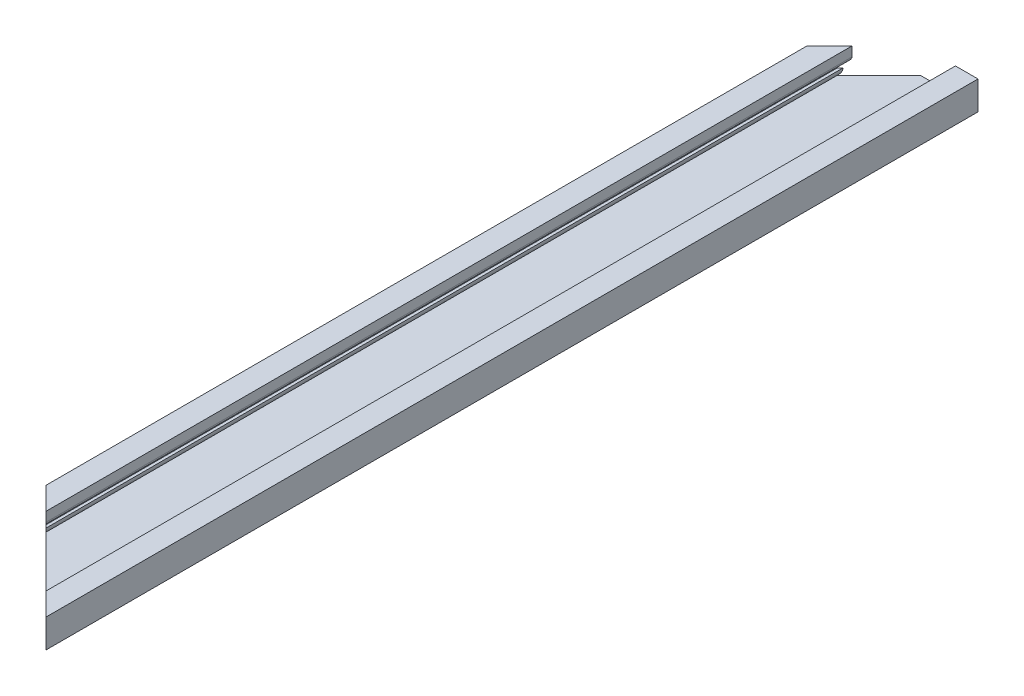
ISO-10303-21;
HEADER;
FILE_DESCRIPTION(('STEP AP214'),'2;1');
FILE_NAME('part.step','',(''),(''),'','','');
FILE_SCHEMA(('AUTOMOTIVE_DESIGN { 1 0 10303 214 1 1 1 1 }'));
ENDSEC;
DATA;
#1=APPLICATION_CONTEXT('core data for automotive mechanical design processes');
#2=APPLICATION_PROTOCOL_DEFINITION('international standard','automotive_design',2000,#1);
#3=PRODUCT_CONTEXT('',#1,'mechanical');
#4=PRODUCT('Part','Part','',(#3));
#5=PRODUCT_RELATED_PRODUCT_CATEGORY('part','',(#4));
#6=PRODUCT_DEFINITION_FORMATION('','',#4);
#7=PRODUCT_DEFINITION_CONTEXT('part definition',#1,'design');
#8=PRODUCT_DEFINITION('design','',#6,#7);
#9=PRODUCT_DEFINITION_SHAPE('','',#8);
#10=(LENGTH_UNIT() NAMED_UNIT(*) SI_UNIT(.MILLI.,.METRE.));
#11=(NAMED_UNIT(*) PLANE_ANGLE_UNIT() SI_UNIT($,.RADIAN.));
#12=(NAMED_UNIT(*) SI_UNIT($,.STERADIAN.) SOLID_ANGLE_UNIT());
#13=UNCERTAINTY_MEASURE_WITH_UNIT(LENGTH_MEASURE(1.E-05),#10,'distance_accuracy_value','');
#14=(GEOMETRIC_REPRESENTATION_CONTEXT(3) GLOBAL_UNCERTAINTY_ASSIGNED_CONTEXT((#13)) GLOBAL_UNIT_ASSIGNED_CONTEXT((#10,
#11,#12)) REPRESENTATION_CONTEXT('',''));
#15=CARTESIAN_POINT('',(0.,0.,0.));
#16=DIRECTION('',(0.,0.,1.));
#17=DIRECTION('',(1.,0.,0.));
#18=AXIS2_PLACEMENT_3D('',#15,#16,#17);
#19=CARTESIAN_POINT('',(-30.,7.5,520.));
#20=DIRECTION('',(0.,-1.,0.));
#21=DIRECTION('',(0.,0.,-1.));
#22=AXIS2_PLACEMENT_3D('',#19,#20,#21);
#23=PLANE('',#22);
#24=DIRECTION('',(0.707106781186546,0.,-0.707106781186549));
#25=VECTOR('',#24,1.);
#26=CARTESIAN_POINT('',(15.0000000000001,7.5,15.));
#27=LINE('',#26,#25);
#28=CARTESIAN_POINT('',(-30.,7.5,60.0000000000002));
#29=VERTEX_POINT('',#28);
#30=CARTESIAN_POINT('',(-18.1568883594902,7.5,48.1568883594904));
#31=VERTEX_POINT('',#30);
#32=EDGE_CURVE('E276',#29,#31,#27,.T.);
#33=ORIENTED_EDGE('',*,*,#32,.F.);
#34=DIRECTION('',(0.,0.,-1.));
#35=VECTOR('',#34,1.);
#36=CARTESIAN_POINT('',(-30.,7.5,520.));
#37=LINE('',#36,#35);
#38=CARTESIAN_POINT('',(-30.,7.5,460.));
#39=VERTEX_POINT('',#38);
#40=EDGE_CURVE('E201',#39,#29,#37,.T.);
#41=ORIENTED_EDGE('',*,*,#40,.F.);
#42=DIRECTION('',(0.707106781186546,0.,0.707106781186549));
#43=VECTOR('',#42,1.);
#44=CARTESIAN_POINT('',(-245.,7.5,244.999999999999));
#45=LINE('',#44,#43);
#46=CARTESIAN_POINT('',(-18.1568883594903,7.5,471.84311164051));
#47=VERTEX_POINT('',#46);
#48=EDGE_CURVE('E288',#39,#47,#45,.T.);
#49=ORIENTED_EDGE('',*,*,#48,.T.);
#50=DIRECTION('',(0.,0.,-1.));
#51=VECTOR('',#50,1.);
#52=CARTESIAN_POINT('',(-18.1568883594903,7.5,520.));
#53=LINE('',#52,#51);
#54=EDGE_CURVE('E358',#47,#31,#53,.T.);
#55=ORIENTED_EDGE('',*,*,#54,.T.);
#56=EDGE_LOOP('',(#33,#41,#49,#55));
#57=FACE_BOUND('',#56,.T.);
#58=ADVANCED_FACE('F43',(#57),#23,.F.);
#59=CARTESIAN_POINT('',(25.,0.5,520.));
#60=DIRECTION('',(0.,1.,0.));
#61=DIRECTION('',(-1.,0.,0.));
#62=AXIS2_PLACEMENT_3D('',#59,#60,#61);
#63=PLANE('',#62);
#64=DIRECTION('',(-0.707106781186546,0.,0.707106781186549));
#65=VECTOR('',#64,1.);
#66=CARTESIAN_POINT('',(-232.5,0.499999999999999,262.500000000001));
#67=LINE('',#66,#65);
#68=CARTESIAN_POINT('',(-20.1568883594903,0.5,50.1568883594904));
#69=VERTEX_POINT('',#68);
#70=CARTESIAN_POINT('',(-25.,0.5,55.0000000000002));
#71=VERTEX_POINT('',#70);
#72=EDGE_CURVE('E348',#69,#71,#67,.T.);
#73=ORIENTED_EDGE('',*,*,#72,.F.);
#74=DIRECTION('',(0.,0.,-1.));
#75=VECTOR('',#74,1.);
#76=CARTESIAN_POINT('',(-20.1568883594903,0.5,520.));
#77=LINE('',#76,#75);
#78=CARTESIAN_POINT('',(-20.1568883594903,0.5,469.84311164051));
#79=VERTEX_POINT('',#78);
#80=EDGE_CURVE('E219',#69,#79,#77,.F.);
#81=ORIENTED_EDGE('',*,*,#80,.T.);
#82=DIRECTION('',(-0.707106781186546,0.,-0.707106781186549));
#83=VECTOR('',#82,1.);
#84=CARTESIAN_POINT('',(27.5,0.5,517.5));
#85=LINE('',#84,#83);
#86=CARTESIAN_POINT('',(-25.,0.5,465.));
#87=VERTEX_POINT('',#86);
#88=EDGE_CURVE('E324',#79,#87,#85,.T.);
#89=ORIENTED_EDGE('',*,*,#88,.T.);
#90=DIRECTION('',(0.,0.,-1.));
#91=VECTOR('',#90,1.);
#92=CARTESIAN_POINT('',(-25.,0.5,520.));
#93=LINE('',#92,#91);
#94=EDGE_CURVE('E373',#87,#71,#93,.T.);
#95=ORIENTED_EDGE('',*,*,#94,.T.);
#96=EDGE_LOOP('',(#73,#81,#89,#95));
#97=FACE_BOUND('',#96,.T.);
#98=ADVANCED_FACE('F416',(#97),#63,.F.);
#99=DIRECTION('',(0.,0.,-1.));
#100=VECTOR('',#99,1.);
#101=CARTESIAN_POINT('',(30.,7.5,520.));
#102=LINE('',#101,#100);
#103=CARTESIAN_POINT('',(30.,7.5,520.));
#104=VERTEX_POINT('',#103);
#105=CARTESIAN_POINT('',(30.,7.5,30.0000000000001));
#106=VERTEX_POINT('',#105);
#107=EDGE_CURVE('E190',#104,#106,#102,.T.);
#108=ORIENTED_EDGE('',*,*,#107,.T.);
#109=DIRECTION('',(-1.,0.,0.));
#110=VECTOR('',#109,1.);
#111=CARTESIAN_POINT('',(30.,7.5,30.0000000000001));
#112=LINE('',#111,#110);
#113=CARTESIAN_POINT('',(18.1431116405097,7.5,30.0000000000001));
#114=VERTEX_POINT('',#113);
#115=EDGE_CURVE('E174',#106,#114,#112,.T.);
#116=ORIENTED_EDGE('',*,*,#115,.T.);
#117=DIRECTION('',(0.,0.,-1.));
#118=VECTOR('',#117,1.);
#119=CARTESIAN_POINT('',(18.1431116405097,7.5,520.));
#120=LINE('',#119,#118);
#121=CARTESIAN_POINT('',(18.1431116405097,7.5,508.14311164051));
#122=VERTEX_POINT('',#121);
#123=EDGE_CURVE('E359',#122,#114,#120,.T.);
#124=ORIENTED_EDGE('',*,*,#123,.F.);
#125=EDGE_CURVE('E198',#122,#104,#45,.T.);
#126=ORIENTED_EDGE('',*,*,#125,.T.);
#127=EDGE_LOOP('',(#108,#116,#124,#126));
#128=FACE_BOUND('',#127,.T.);
#129=ADVANCED_FACE('F197',(#128),#23,.F.);
#130=CARTESIAN_POINT('',(-30.,7.5,520.));
#131=DIRECTION('',(1.,0.,0.));
#132=DIRECTION('',(0.,1.,0.));
#133=AXIS2_PLACEMENT_3D('',#130,#131,#132);
#134=PLANE('',#133);
#135=DIRECTION('',(0.,-1.,0.));
#136=VECTOR('',#135,1.);
#137=CARTESIAN_POINT('',(-30.,7.5,60.0000000000002));
#138=LINE('',#137,#136);
#139=CARTESIAN_POINT('',(-30.,-7.5,60.0000000000002));
#140=VERTEX_POINT('',#139);
#141=EDGE_CURVE('E279',#29,#140,#138,.T.);
#142=ORIENTED_EDGE('',*,*,#141,.T.);
#143=DIRECTION('',(0.,0.,-1.));
#144=VECTOR('',#143,1.);
#145=CARTESIAN_POINT('',(-30.,-7.5,520.));
#146=LINE('',#145,#144);
#147=CARTESIAN_POINT('',(-30.,-7.5,460.));
#148=VERTEX_POINT('',#147);
#149=EDGE_CURVE('E208',#148,#140,#146,.T.);
#150=ORIENTED_EDGE('',*,*,#149,.F.);
#151=DIRECTION('',(0.,-1.,0.));
#152=VECTOR('',#151,1.);
#153=CARTESIAN_POINT('',(-30.,7.5,460.));
#154=LINE('',#153,#152);
#155=EDGE_CURVE('E284',#39,#148,#154,.T.);
#156=ORIENTED_EDGE('',*,*,#155,.F.);
#157=ORIENTED_EDGE('',*,*,#40,.T.);
#158=EDGE_LOOP('',(#142,#150,#156,#157));
#159=FACE_BOUND('',#158,.T.);
#160=ADVANCED_FACE('F399',(#159),#134,.F.);
#161=CARTESIAN_POINT('',(-30.,-7.5,520.));
#162=DIRECTION('',(0.,1.,0.));
#163=DIRECTION('',(0.,0.,1.));
#164=AXIS2_PLACEMENT_3D('',#161,#162,#163);
#165=PLANE('',#164);
#166=DIRECTION('',(0.707106781186546,0.,-0.707106781186549));
#167=VECTOR('',#166,1.);
#168=CARTESIAN_POINT('',(15.0000000000001,-7.5,15.));
#169=LINE('',#168,#167);
#170=CARTESIAN_POINT('',(0.,-7.5,30.0000000000001));
#171=VERTEX_POINT('',#170);
#172=EDGE_CURVE('E280',#140,#171,#169,.T.);
#173=ORIENTED_EDGE('',*,*,#172,.T.);
#174=DIRECTION('',(1.,0.,0.));
#175=VECTOR('',#174,1.);
#176=CARTESIAN_POINT('',(-29.9999999999999,-7.5,30.0000000000001));
#177=LINE('',#176,#175);
#178=CARTESIAN_POINT('',(30.,-7.5,30.0000000000001));
#179=VERTEX_POINT('',#178);
#180=EDGE_CURVE('E58',#171,#179,#177,.T.);
#181=ORIENTED_EDGE('',*,*,#180,.T.);
#182=DIRECTION('',(0.,0.,-1.));
#183=VECTOR('',#182,1.);
#184=CARTESIAN_POINT('',(30.,-7.5,520.));
#185=LINE('',#184,#183);
#186=CARTESIAN_POINT('',(30.,-7.5,520.));
#187=VERTEX_POINT('',#186);
#188=EDGE_CURVE('E192',#187,#179,#185,.T.);
#189=ORIENTED_EDGE('',*,*,#188,.F.);
#190=DIRECTION('',(0.707106781186546,0.,0.707106781186549));
#191=VECTOR('',#190,1.);
#192=CARTESIAN_POINT('',(-245.,-7.5,244.999999999999));
#193=LINE('',#192,#191);
#194=EDGE_CURVE('E275',#148,#187,#193,.T.);
#195=ORIENTED_EDGE('',*,*,#194,.F.);
#196=ORIENTED_EDGE('',*,*,#149,.T.);
#197=EDGE_LOOP('',(#173,#181,#189,#195,#196));
#198=FACE_BOUND('',#197,.T.);
#199=ADVANCED_FACE('F396',(#198),#165,.F.);
#200=CARTESIAN_POINT('',(-25.,-2.5,520.));
#201=DIRECTION('',(0.,0.,-1.));
#202=DIRECTION('',(-1.,0.,0.));
#203=AXIS2_PLACEMENT_3D('',#200,#201,#202);
#204=CYLINDRICAL_SURFACE('',#203,3.);
#205=CARTESIAN_POINT('',(-25.,-2.5,55.0000000000002));
#206=DIRECTION('',(-0.707106781186549,0.,-0.707106781186546));
#207=DIRECTION('',(0.707106781186546,0.,-0.707106781186549));
#208=AXIS2_PLACEMENT_3D('',#205,#206,#207);
#209=ELLIPSE('',#208,4.2426406871193,3.);
#210=CARTESIAN_POINT('',(-22.,-2.5,52.0000000000001));
#211=VERTEX_POINT('',#210);
#212=EDGE_CURVE('E345',#71,#211,#209,.F.);
#213=ORIENTED_EDGE('',*,*,#212,.F.);
#214=ORIENTED_EDGE('',*,*,#94,.F.);
#215=CARTESIAN_POINT('',(-25.,-2.5,465.));
#216=DIRECTION('',(0.707106781186549,0.,-0.707106781186546));
#217=DIRECTION('',(-0.707106781186546,0.,-0.707106781186549));
#218=AXIS2_PLACEMENT_3D('',#215,#216,#217);
#219=ELLIPSE('',#218,4.2426406871193,3.);
#220=CARTESIAN_POINT('',(-22.,-2.5,468.));
#221=VERTEX_POINT('',#220);
#222=EDGE_CURVE('E320',#87,#221,#219,.F.);
#223=ORIENTED_EDGE('',*,*,#222,.T.);
#224=DIRECTION('',(0.,0.,-1.));
#225=VECTOR('',#224,1.);
#226=CARTESIAN_POINT('',(-22.,-2.5,520.));
#227=LINE('',#226,#225);
#228=EDGE_CURVE('E205',#221,#211,#227,.T.);
#229=ORIENTED_EDGE('',*,*,#228,.T.);
#230=EDGE_LOOP('',(#213,#214,#223,#229));
#231=FACE_BOUND('',#230,.T.);
#232=ADVANCED_FACE('F421',(#231),#204,.F.);
#233=CARTESIAN_POINT('',(25.,-2.5,520.));
#234=DIRECTION('',(0.,0.,-1.));
#235=DIRECTION('',(-1.,0.,0.));
#236=AXIS2_PLACEMENT_3D('',#233,#234,#235);
#237=CYLINDRICAL_SURFACE('',#236,3.);
#238=DIRECTION('',(0.,0.,-1.));
#239=VECTOR('',#238,1.);
#240=CARTESIAN_POINT('',(25.,0.5,520.));
#241=LINE('',#240,#239);
#242=CARTESIAN_POINT('',(25.,0.5,515.));
#243=VERTEX_POINT('',#242);
#244=CARTESIAN_POINT('',(25.,0.5,30.0000000000001));
#245=VERTEX_POINT('',#244);
#246=EDGE_CURVE('E244',#243,#245,#241,.T.);
#247=ORIENTED_EDGE('',*,*,#246,.T.);
#248=CARTESIAN_POINT('',(25.,-2.5,30.0000000000001));
#249=DIRECTION('',(0.,0.,1.));
#250=DIRECTION('',(1.,0.,0.));
#251=AXIS2_PLACEMENT_3D('',#248,#249,#250);
#252=CIRCLE('',#251,3.);
#253=CARTESIAN_POINT('',(22.,-2.5,30.0000000000001));
#254=VERTEX_POINT('',#253);
#255=EDGE_CURVE('E257',#245,#254,#252,.F.);
#256=ORIENTED_EDGE('',*,*,#255,.T.);
#257=DIRECTION('',(0.,0.,-1.));
#258=VECTOR('',#257,1.);
#259=CARTESIAN_POINT('',(22.,-2.5,520.));
#260=LINE('',#259,#258);
#261=CARTESIAN_POINT('',(22.,-2.5,512.));
#262=VERTEX_POINT('',#261);
#263=EDGE_CURVE('E200',#254,#262,#260,.F.);
#264=ORIENTED_EDGE('',*,*,#263,.T.);
#265=CARTESIAN_POINT('',(25.,-2.5,515.));
#266=DIRECTION('',(0.707106781186549,0.,-0.707106781186546));
#267=DIRECTION('',(-0.707106781186546,0.,-0.707106781186549));
#268=AXIS2_PLACEMENT_3D('',#265,#266,#267);
#269=ELLIPSE('',#268,4.2426406871193,3.);
#270=EDGE_CURVE('E246',#262,#243,#269,.F.);
#271=ORIENTED_EDGE('',*,*,#270,.T.);
#272=EDGE_LOOP('',(#247,#256,#264,#271));
#273=FACE_BOUND('',#272,.T.);
#274=ADVANCED_FACE('F441',(#273),#237,.F.);
#275=DIRECTION('',(0.,0.,-1.));
#276=VECTOR('',#275,1.);
#277=CARTESIAN_POINT('',(20.1431116405097,0.5,520.));
#278=LINE('',#277,#276);
#279=CARTESIAN_POINT('',(20.1431116405097,0.5,510.14311164051));
#280=VERTEX_POINT('',#279);
#281=CARTESIAN_POINT('',(20.1431116405097,0.5,30.0000000000001));
#282=VERTEX_POINT('',#281);
#283=EDGE_CURVE('E223',#280,#282,#278,.T.);
#284=ORIENTED_EDGE('',*,*,#283,.T.);
#285=DIRECTION('',(1.,0.,0.));
#286=VECTOR('',#285,1.);
#287=CARTESIAN_POINT('',(25.0000000000001,0.5,30.0000000000001));
#288=LINE('',#287,#286);
#289=EDGE_CURVE('E252',#282,#245,#288,.T.);
#290=ORIENTED_EDGE('',*,*,#289,.T.);
#291=ORIENTED_EDGE('',*,*,#246,.F.);
#292=DIRECTION('',(-0.707106781186546,0.,-0.707106781186549));
#293=VECTOR('',#292,1.);
#294=CARTESIAN_POINT('',(27.5,0.5,517.5));
#295=LINE('',#294,#293);
#296=EDGE_CURVE('E234',#243,#280,#295,.T.);
#297=ORIENTED_EDGE('',*,*,#296,.T.);
#298=EDGE_LOOP('',(#284,#290,#291,#297));
#299=FACE_BOUND('',#298,.T.);
#300=ADVANCED_FACE('F241',(#299),#63,.F.);
#301=CARTESIAN_POINT('',(-25.,-2.5,520.));
#302=DIRECTION('',(0.,-1.,0.));
#303=DIRECTION('',(1.,0.,0.));
#304=AXIS2_PLACEMENT_3D('',#301,#302,#303);
#305=PLANE('',#304);
#306=DIRECTION('',(0.707106781186546,0.,-0.707106781186549));
#307=VECTOR('',#306,1.);
#308=CARTESIAN_POINT('',(-257.5,-2.49999999999993,287.500000000001));
#309=LINE('',#308,#307);
#310=CARTESIAN_POINT('',(-20.5,-2.5,50.5000000000002));
#311=VERTEX_POINT('',#310);
#312=EDGE_CURVE('E342',#211,#311,#309,.T.);
#313=ORIENTED_EDGE('',*,*,#312,.F.);
#314=ORIENTED_EDGE('',*,*,#228,.F.);
#315=DIRECTION('',(0.707106781186546,0.,0.707106781186549));
#316=VECTOR('',#315,1.);
#317=CARTESIAN_POINT('',(2.50000000000011,-2.50000000000001,492.5));
#318=LINE('',#317,#316);
#319=CARTESIAN_POINT('',(-20.5,-2.5,469.5));
#320=VERTEX_POINT('',#319);
#321=EDGE_CURVE('E316',#221,#320,#318,.T.);
#322=ORIENTED_EDGE('',*,*,#321,.T.);
#323=DIRECTION('',(0.,0.,-1.));
#324=VECTOR('',#323,1.);
#325=CARTESIAN_POINT('',(-20.5,-2.5,520.));
#326=LINE('',#325,#324);
#327=EDGE_CURVE('E377',#320,#311,#326,.T.);
#328=ORIENTED_EDGE('',*,*,#327,.T.);
#329=EDGE_LOOP('',(#313,#314,#322,#328));
#330=FACE_BOUND('',#329,.T.);
#331=ADVANCED_FACE('F424',(#330),#305,.F.);
#332=CARTESIAN_POINT('',(20.5,-2.5,520.));
#333=DIRECTION('',(0.,-1.,0.));
#334=DIRECTION('',(1.,0.,0.));
#335=AXIS2_PLACEMENT_3D('',#332,#333,#334);
#336=PLANE('',#335);
#337=ORIENTED_EDGE('',*,*,#263,.F.);
#338=DIRECTION('',(-1.,0.,0.));
#339=VECTOR('',#338,1.);
#340=CARTESIAN_POINT('',(20.5000000000001,-2.5,30.0000000000001));
#341=LINE('',#340,#339);
#342=CARTESIAN_POINT('',(20.5,-2.5,30.0000000000001));
#343=VERTEX_POINT('',#342);
#344=EDGE_CURVE('E261',#254,#343,#341,.T.);
#345=ORIENTED_EDGE('',*,*,#344,.T.);
#346=DIRECTION('',(0.,0.,-1.));
#347=VECTOR('',#346,1.);
#348=CARTESIAN_POINT('',(20.5,-2.5,520.));
#349=LINE('',#348,#347);
#350=CARTESIAN_POINT('',(20.5,-2.5,510.5));
#351=VERTEX_POINT('',#350);
#352=EDGE_CURVE('E366',#351,#343,#349,.T.);
#353=ORIENTED_EDGE('',*,*,#352,.F.);
#354=DIRECTION('',(0.707106781186546,0.,0.707106781186549));
#355=VECTOR('',#354,1.);
#356=CARTESIAN_POINT('',(25.25,-2.5,515.25));
#357=LINE('',#356,#355);
#358=EDGE_CURVE('E300',#351,#262,#357,.T.);
#359=ORIENTED_EDGE('',*,*,#358,.T.);
#360=EDGE_LOOP('',(#337,#345,#353,#359));
#361=FACE_BOUND('',#360,.T.);
#362=ADVANCED_FACE('F439',(#361),#336,.F.);
#363=CARTESIAN_POINT('',(25.,-2.5,520.));
#364=DIRECTION('',(0.,0.,-1.));
#365=DIRECTION('',(-1.,0.,0.));
#366=AXIS2_PLACEMENT_3D('',#363,#364,#365);
#367=CYLINDRICAL_SURFACE('',#366,4.5);
#368=ORIENTED_EDGE('',*,*,#352,.T.);
#369=CARTESIAN_POINT('',(25.,-2.5,30.0000000000001));
#370=DIRECTION('',(0.,0.,1.));
#371=DIRECTION('',(1.,0.,0.));
#372=AXIS2_PLACEMENT_3D('',#369,#370,#371);
#373=CIRCLE('',#372,4.5);
#374=CARTESIAN_POINT('',(22.1715728752538,-5.99999999999999,30.0000000000001));
#375=VERTEX_POINT('',#374);
#376=EDGE_CURVE('E265',#343,#375,#373,.T.);
#377=ORIENTED_EDGE('',*,*,#376,.T.);
#378=DIRECTION('',(0.,0.,-1.));
#379=VECTOR('',#378,1.);
#380=CARTESIAN_POINT('',(22.1715728752538,-6.,520.));
#381=LINE('',#380,#379);
#382=CARTESIAN_POINT('',(22.1715728752538,-6.,512.171572875254));
#383=VERTEX_POINT('',#382);
#384=EDGE_CURVE('E362',#383,#375,#381,.T.);
#385=ORIENTED_EDGE('',*,*,#384,.F.);
#386=CARTESIAN_POINT('',(25.,-2.5,515.));
#387=DIRECTION('',(0.707106781186549,0.,-0.707106781186546));
#388=DIRECTION('',(-0.707106781186546,0.,-0.707106781186549));
#389=AXIS2_PLACEMENT_3D('',#386,#387,#388);
#390=ELLIPSE('',#389,6.36396103067894,4.5);
#391=EDGE_CURVE('E304',#383,#351,#390,.T.);
#392=ORIENTED_EDGE('',*,*,#391,.T.);
#393=EDGE_LOOP('',(#368,#377,#385,#392));
#394=FACE_BOUND('',#393,.T.);
#395=ADVANCED_FACE('F435',(#394),#367,.T.);
#396=CARTESIAN_POINT('',(-25.,-2.5,520.));
#397=DIRECTION('',(0.,0.,-1.));
#398=DIRECTION('',(-1.,0.,0.));
#399=AXIS2_PLACEMENT_3D('',#396,#397,#398);
#400=CYLINDRICAL_SURFACE('',#399,4.5);
#401=CARTESIAN_POINT('',(-25.,-2.5,55.0000000000002));
#402=DIRECTION('',(-0.707106781186549,0.,-0.707106781186546));
#403=DIRECTION('',(0.707106781186546,0.,-0.707106781186549));
#404=AXIS2_PLACEMENT_3D('',#401,#402,#403);
#405=ELLIPSE('',#404,6.36396103067895,4.5);
#406=CARTESIAN_POINT('',(-22.1715728752538,-6.,52.1715728752539));
#407=VERTEX_POINT('',#406);
#408=EDGE_CURVE('E339',#311,#407,#405,.T.);
#409=ORIENTED_EDGE('',*,*,#408,.F.);
#410=ORIENTED_EDGE('',*,*,#327,.F.);
#411=CARTESIAN_POINT('',(-25.,-2.5,465.));
#412=DIRECTION('',(0.707106781186549,0.,-0.707106781186546));
#413=DIRECTION('',(-0.707106781186546,0.,-0.707106781186549));
#414=AXIS2_PLACEMENT_3D('',#411,#412,#413);
#415=ELLIPSE('',#414,6.36396103067895,4.5);
#416=CARTESIAN_POINT('',(-22.1715728752538,-6.,467.828427124746));
#417=VERTEX_POINT('',#416);
#418=EDGE_CURVE('E312',#320,#417,#415,.T.);
#419=ORIENTED_EDGE('',*,*,#418,.T.);
#420=DIRECTION('',(0.,0.,-1.));
#421=VECTOR('',#420,1.);
#422=CARTESIAN_POINT('',(-22.1715728752538,-6.,520.));
#423=LINE('',#422,#421);
#424=EDGE_CURVE('E381',#417,#407,#423,.T.);
#425=ORIENTED_EDGE('',*,*,#424,.T.);
#426=EDGE_LOOP('',(#409,#410,#419,#425));
#427=FACE_BOUND('',#426,.T.);
#428=ADVANCED_FACE('F429',(#427),#400,.T.);
#429=CARTESIAN_POINT('',(22.1715728752538,-6.,520.));
#430=DIRECTION('',(0.,-1.,0.));
#431=DIRECTION('',(0.,0.,-1.));
#432=AXIS2_PLACEMENT_3D('',#429,#430,#431);
#433=PLANE('',#432);
#434=ORIENTED_EDGE('',*,*,#384,.T.);
#435=DIRECTION('',(-1.,0.,0.));
#436=VECTOR('',#435,1.);
#437=CARTESIAN_POINT('',(22.1715728752539,-6.,30.0000000000001));
#438=LINE('',#437,#436);
#439=CARTESIAN_POINT('',(0.,-6.,30.0000000000001));
#440=VERTEX_POINT('',#439);
#441=EDGE_CURVE('E269',#375,#440,#438,.T.);
#442=ORIENTED_EDGE('',*,*,#441,.T.);
#443=DIRECTION('',(0.707106781186546,0.,-0.707106781186549));
#444=VECTOR('',#443,1.);
#445=CARTESIAN_POINT('',(-233.914213562373,-6.,263.914213562374));
#446=LINE('',#445,#444);
#447=EDGE_CURVE('E335',#407,#440,#446,.T.);
#448=ORIENTED_EDGE('',*,*,#447,.F.);
#449=ORIENTED_EDGE('',*,*,#424,.F.);
#450=DIRECTION('',(0.707106781186546,0.,0.707106781186549));
#451=VECTOR('',#450,1.);
#452=CARTESIAN_POINT('',(26.0857864376269,-6.,516.085786437627));
#453=LINE('',#452,#451);
#454=EDGE_CURVE('E308',#417,#383,#453,.T.);
#455=ORIENTED_EDGE('',*,*,#454,.T.);
#456=EDGE_LOOP('',(#434,#442,#448,#449,#455));
#457=FACE_BOUND('',#456,.T.);
#458=ADVANCED_FACE('F432',(#457),#433,.F.);
#459=CARTESIAN_POINT('',(18.1431116405097,0.5,520.));
#460=DIRECTION('',(1.,0.,0.));
#461=DIRECTION('',(0.,0.,-1.));
#462=AXIS2_PLACEMENT_3D('',#459,#460,#461);
#463=PLANE('',#462);
#464=ORIENTED_EDGE('',*,*,#123,.T.);
#465=DIRECTION('',(0.,-1.,0.));
#466=VECTOR('',#465,1.);
#467=CARTESIAN_POINT('',(18.1431116405097,0.5,30.0000000000001));
#468=LINE('',#467,#466);
#469=CARTESIAN_POINT('',(18.1431116405097,2.5,30.0000000000001));
#470=VERTEX_POINT('',#469);
#471=EDGE_CURVE('E178',#114,#470,#468,.T.);
#472=ORIENTED_EDGE('',*,*,#471,.T.);
#473=DIRECTION('',(0.,0.,-1.));
#474=VECTOR('',#473,1.);
#475=CARTESIAN_POINT('',(18.1431116405097,2.5,520.));
#476=LINE('',#475,#474);
#477=CARTESIAN_POINT('',(18.1431116405097,2.5,508.14311164051));
#478=VERTEX_POINT('',#477);
#479=EDGE_CURVE('E66',#470,#478,#476,.F.);
#480=ORIENTED_EDGE('',*,*,#479,.T.);
#481=DIRECTION('',(0.,1.,0.));
#482=VECTOR('',#481,1.);
#483=CARTESIAN_POINT('',(18.1431116405097,0.5,508.14311164051));
#484=LINE('',#483,#482);
#485=EDGE_CURVE('E236',#478,#122,#484,.T.);
#486=ORIENTED_EDGE('',*,*,#485,.T.);
#487=EDGE_LOOP('',(#464,#472,#480,#486));
#488=FACE_BOUND('',#487,.T.);
#489=ADVANCED_FACE('F443',(#488),#463,.F.);
#490=CARTESIAN_POINT('',(-18.1568883594903,7.5,520.));
#491=DIRECTION('',(-1.,0.,0.));
#492=DIRECTION('',(0.,0.,1.));
#493=AXIS2_PLACEMENT_3D('',#490,#491,#492);
#494=PLANE('',#493);
#495=DIRECTION('',(0.,-1.,0.));
#496=VECTOR('',#495,1.);
#497=CARTESIAN_POINT('',(-18.1568883594903,7.5,48.1568883594904));
#498=LINE('',#497,#496);
#499=CARTESIAN_POINT('',(-18.1568883594903,2.5,48.1568883594905));
#500=VERTEX_POINT('',#499);
#501=EDGE_CURVE('E355',#31,#500,#498,.T.);
#502=ORIENTED_EDGE('',*,*,#501,.F.);
#503=ORIENTED_EDGE('',*,*,#54,.F.);
#504=DIRECTION('',(0.,-1.,0.));
#505=VECTOR('',#504,1.);
#506=CARTESIAN_POINT('',(-18.1568883594903,7.5,471.84311164051));
#507=LINE('',#506,#505);
#508=CARTESIAN_POINT('',(-18.1568883594903,2.5,471.84311164051));
#509=VERTEX_POINT('',#508);
#510=EDGE_CURVE('E331',#47,#509,#507,.T.);
#511=ORIENTED_EDGE('',*,*,#510,.T.);
#512=DIRECTION('',(0.,0.,-1.));
#513=VECTOR('',#512,1.);
#514=CARTESIAN_POINT('',(-18.1568883594903,2.5,520.));
#515=LINE('',#514,#513);
#516=EDGE_CURVE('E215',#509,#500,#515,.T.);
#517=ORIENTED_EDGE('',*,*,#516,.T.);
#518=EDGE_LOOP('',(#502,#503,#511,#517));
#519=FACE_BOUND('',#518,.T.);
#520=ADVANCED_FACE('F408',(#519),#494,.F.);
#521=CARTESIAN_POINT('',(-20.1568883594903,2.5,520.));
#522=DIRECTION('',(0.,0.,-1.));
#523=DIRECTION('',(-1.,0.,0.));
#524=AXIS2_PLACEMENT_3D('',#521,#522,#523);
#525=CYLINDRICAL_SURFACE('',#524,2.);
#526=ORIENTED_EDGE('',*,*,#80,.F.);
#527=CARTESIAN_POINT('',(-20.1568883594903,2.5,50.1568883594905));
#528=DIRECTION('',(-0.707106781186549,0.,-0.707106781186546));
#529=DIRECTION('',(0.707106781186546,0.,-0.707106781186549));
#530=AXIS2_PLACEMENT_3D('',#527,#528,#529);
#531=ELLIPSE('',#530,2.8284271247462,2.);
#532=EDGE_CURVE('E351',#69,#500,#531,.F.);
#533=ORIENTED_EDGE('',*,*,#532,.T.);
#534=ORIENTED_EDGE('',*,*,#516,.F.);
#535=CARTESIAN_POINT('',(-20.1568883594903,2.5,469.84311164051));
#536=DIRECTION('',(0.707106781186549,0.,-0.707106781186546));
#537=DIRECTION('',(-0.707106781186546,0.,-0.707106781186549));
#538=AXIS2_PLACEMENT_3D('',#535,#536,#537);
#539=ELLIPSE('',#538,2.8284271247462,2.);
#540=EDGE_CURVE('E328',#79,#509,#539,.F.);
#541=ORIENTED_EDGE('',*,*,#540,.F.);
#542=EDGE_LOOP('',(#526,#533,#534,#541));
#543=FACE_BOUND('',#542,.T.);
#544=ADVANCED_FACE('F413',(#543),#525,.T.);
#545=CARTESIAN_POINT('',(20.1431116405097,2.5,520.));
#546=DIRECTION('',(0.,0.,-1.));
#547=DIRECTION('',(-1.,0.,0.));
#548=AXIS2_PLACEMENT_3D('',#545,#546,#547);
#549=CYLINDRICAL_SURFACE('',#548,2.);
#550=CARTESIAN_POINT('',(20.1431116405097,2.5,30.0000000000001));
#551=DIRECTION('',(0.,0.,1.));
#552=DIRECTION('',(1.,0.,0.));
#553=AXIS2_PLACEMENT_3D('',#550,#551,#552);
#554=CIRCLE('',#553,2.);
#555=EDGE_CURVE('E194',#282,#470,#554,.F.);
#556=ORIENTED_EDGE('',*,*,#555,.F.);
#557=ORIENTED_EDGE('',*,*,#283,.F.);
#558=CARTESIAN_POINT('',(20.1431116405097,2.5,510.14311164051));
#559=DIRECTION('',(0.707106781186549,0.,-0.707106781186546));
#560=DIRECTION('',(-0.707106781186546,0.,-0.707106781186549));
#561=AXIS2_PLACEMENT_3D('',#558,#559,#560);
#562=ELLIPSE('',#561,2.8284271247462,2.);
#563=EDGE_CURVE('E52',#478,#280,#562,.F.);
#564=ORIENTED_EDGE('',*,*,#563,.F.);
#565=ORIENTED_EDGE('',*,*,#479,.F.);
#566=EDGE_LOOP('',(#556,#557,#564,#565));
#567=FACE_BOUND('',#566,.T.);
#568=ADVANCED_FACE('F45',(#567),#549,.T.);
#569=CARTESIAN_POINT('',(30.,7.5,520.));
#570=DIRECTION('',(-1.,0.,0.));
#571=DIRECTION('',(0.,-1.,0.));
#572=AXIS2_PLACEMENT_3D('',#569,#570,#571);
#573=PLANE('',#572);
#574=ORIENTED_EDGE('',*,*,#188,.T.);
#575=DIRECTION('',(0.,-1.,0.));
#576=VECTOR('',#575,1.);
#577=CARTESIAN_POINT('',(30.,7.5,30.0000000000001));
#578=LINE('',#577,#576);
#579=EDGE_CURVE('E177',#106,#179,#578,.T.);
#580=ORIENTED_EDGE('',*,*,#579,.F.);
#581=ORIENTED_EDGE('',*,*,#107,.F.);
#582=DIRECTION('',(0.,1.,0.));
#583=VECTOR('',#582,1.);
#584=CARTESIAN_POINT('',(30.,7.5,520.));
#585=LINE('',#584,#583);
#586=EDGE_CURVE('E370',#187,#104,#585,.T.);
#587=ORIENTED_EDGE('',*,*,#586,.F.);
#588=EDGE_LOOP('',(#574,#580,#581,#587));
#589=FACE_BOUND('',#588,.T.);
#590=ADVANCED_FACE('F188',(#589),#573,.F.);
#591=CARTESIAN_POINT('',(-245.,7.5,244.999999999999));
#592=DIRECTION('',(0.707106781186549,0.,-0.707106781186546));
#593=DIRECTION('',(-0.707106781186546,0.,-0.707106781186549));
#594=AXIS2_PLACEMENT_3D('',#591,#592,#593);
#595=PLANE('',#594);
#596=ORIENTED_EDGE('',*,*,#48,.F.);
#597=ORIENTED_EDGE('',*,*,#155,.T.);
#598=ORIENTED_EDGE('',*,*,#194,.T.);
#599=ORIENTED_EDGE('',*,*,#586,.T.);
#600=ORIENTED_EDGE('',*,*,#125,.F.);
#601=ORIENTED_EDGE('',*,*,#485,.F.);
#602=ORIENTED_EDGE('',*,*,#563,.T.);
#603=ORIENTED_EDGE('',*,*,#296,.F.);
#604=ORIENTED_EDGE('',*,*,#270,.F.);
#605=ORIENTED_EDGE('',*,*,#358,.F.);
#606=ORIENTED_EDGE('',*,*,#391,.F.);
#607=ORIENTED_EDGE('',*,*,#454,.F.);
#608=ORIENTED_EDGE('',*,*,#418,.F.);
#609=ORIENTED_EDGE('',*,*,#321,.F.);
#610=ORIENTED_EDGE('',*,*,#222,.F.);
#611=ORIENTED_EDGE('',*,*,#88,.F.);
#612=ORIENTED_EDGE('',*,*,#540,.T.);
#613=ORIENTED_EDGE('',*,*,#510,.F.);
#614=EDGE_LOOP('',(#596,#597,#598,#599,#600,#601,#602,#603,#604,#605,#606,#607,#608,#609,#610,
#611,#612,#613));
#615=FACE_BOUND('',#614,.T.);
#616=ADVANCED_FACE('F232',(#615),#595,.F.);
#617=CARTESIAN_POINT('',(15.0000000000001,7.5,15.));
#618=DIRECTION('',(-0.707106781186549,0.,-0.707106781186546));
#619=DIRECTION('',(-0.707106781186546,0.,0.707106781186549));
#620=AXIS2_PLACEMENT_3D('',#617,#618,#619);
#621=PLANE('',#620);
#622=DIRECTION('',(0.,1.,0.));
#623=VECTOR('',#622,1.);
#624=CARTESIAN_POINT('',(0.,7.5,30.0000000000001));
#625=LINE('',#624,#623);
#626=EDGE_CURVE('E11',#171,#440,#625,.T.);
#627=ORIENTED_EDGE('',*,*,#626,.F.);
#628=ORIENTED_EDGE('',*,*,#172,.F.);
#629=ORIENTED_EDGE('',*,*,#141,.F.);
#630=ORIENTED_EDGE('',*,*,#32,.T.);
#631=ORIENTED_EDGE('',*,*,#501,.T.);
#632=ORIENTED_EDGE('',*,*,#532,.F.);
#633=ORIENTED_EDGE('',*,*,#72,.T.);
#634=ORIENTED_EDGE('',*,*,#212,.T.);
#635=ORIENTED_EDGE('',*,*,#312,.T.);
#636=ORIENTED_EDGE('',*,*,#408,.T.);
#637=ORIENTED_EDGE('',*,*,#447,.T.);
#638=EDGE_LOOP('',(#627,#628,#629,#630,#631,#632,#633,#634,#635,#636,#637));
#639=FACE_BOUND('',#638,.T.);
#640=ADVANCED_FACE('F403',(#639),#621,.T.);
#641=CARTESIAN_POINT('',(30.,7.5,30.0000000000001));
#642=DIRECTION('',(0.,0.,1.));
#643=DIRECTION('',(1.,0.,0.));
#644=AXIS2_PLACEMENT_3D('',#641,#642,#643);
#645=PLANE('',#644);
#646=ORIENTED_EDGE('',*,*,#626,.T.);
#647=ORIENTED_EDGE('',*,*,#441,.F.);
#648=ORIENTED_EDGE('',*,*,#376,.F.);
#649=ORIENTED_EDGE('',*,*,#344,.F.);
#650=ORIENTED_EDGE('',*,*,#255,.F.);
#651=ORIENTED_EDGE('',*,*,#289,.F.);
#652=ORIENTED_EDGE('',*,*,#555,.T.);
#653=ORIENTED_EDGE('',*,*,#471,.F.);
#654=ORIENTED_EDGE('',*,*,#115,.F.);
#655=ORIENTED_EDGE('',*,*,#579,.T.);
#656=ORIENTED_EDGE('',*,*,#180,.F.);
#657=EDGE_LOOP('',(#646,#647,#648,#649,#650,#651,#652,#653,#654,#655,#656));
#658=FACE_BOUND('',#657,.T.);
#659=ADVANCED_FACE('F176',(#658),#645,.F.);
#660=CLOSED_SHELL('',(#58,#98,#129,#160,#199,#232,#274,#300,#331,#362,#395,#428,#458,#489,#520,
#544,#568,#590,#616,#640,#659));
#661=MANIFOLD_SOLID_BREP('B2',#660);
#662=ADVANCED_BREP_SHAPE_REPRESENTATION('',(#18,#661),#14);
#663=SHAPE_DEFINITION_REPRESENTATION(#9,#662);
ENDSEC;
END-ISO-10303-21;
